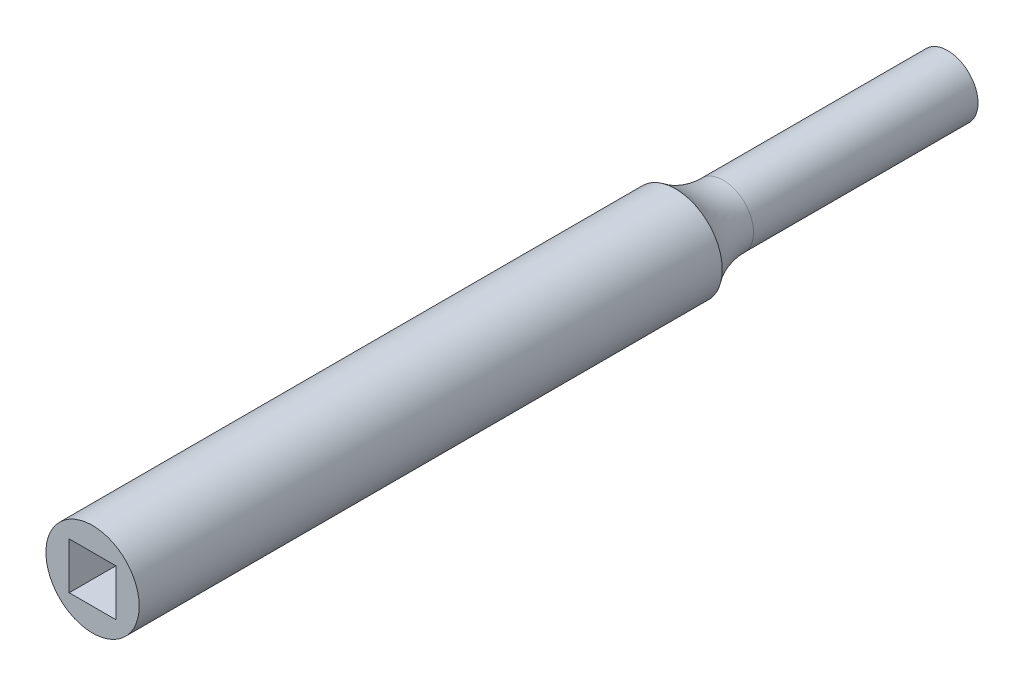
ISO-10303-21;
HEADER;
FILE_DESCRIPTION(('STEP AP214'),'2;1');
FILE_NAME('part.step','',(''),(''),'','','');
FILE_SCHEMA(('AUTOMOTIVE_DESIGN { 1 0 10303 214 1 1 1 1 }'));
ENDSEC;
DATA;
#1=APPLICATION_CONTEXT('core data for automotive mechanical design processes');
#2=APPLICATION_PROTOCOL_DEFINITION('international standard','automotive_design',2000,#1);
#3=PRODUCT_CONTEXT('',#1,'mechanical');
#4=PRODUCT('Part','Part','',(#3));
#5=PRODUCT_RELATED_PRODUCT_CATEGORY('part','',(#4));
#6=PRODUCT_DEFINITION_FORMATION('','',#4);
#7=PRODUCT_DEFINITION_CONTEXT('part definition',#1,'design');
#8=PRODUCT_DEFINITION('design','',#6,#7);
#9=PRODUCT_DEFINITION_SHAPE('','',#8);
#10=(LENGTH_UNIT() NAMED_UNIT(*) SI_UNIT(.MILLI.,.METRE.));
#11=(NAMED_UNIT(*) PLANE_ANGLE_UNIT() SI_UNIT($,.RADIAN.));
#12=(NAMED_UNIT(*) SI_UNIT($,.STERADIAN.) SOLID_ANGLE_UNIT());
#13=UNCERTAINTY_MEASURE_WITH_UNIT(LENGTH_MEASURE(1.E-05),#10,'distance_accuracy_value','');
#14=(GEOMETRIC_REPRESENTATION_CONTEXT(3) GLOBAL_UNCERTAINTY_ASSIGNED_CONTEXT((#13)) GLOBAL_UNIT_ASSIGNED_CONTEXT((#10,
#11,#12)) REPRESENTATION_CONTEXT('',''));
#15=CARTESIAN_POINT('',(0.,0.,0.));
#16=DIRECTION('',(0.,0.,1.));
#17=DIRECTION('',(1.,0.,0.));
#18=AXIS2_PLACEMENT_3D('',#15,#16,#17);
#19=CARTESIAN_POINT('',(0.,0.,35.));
#20=DIRECTION('',(0.,0.,-1.));
#21=DIRECTION('',(-1.,0.,0.));
#22=AXIS2_PLACEMENT_3D('',#19,#20,#21);
#23=CYLINDRICAL_SURFACE('',#22,3.9);
#24=CARTESIAN_POINT('',(0.,0.,28.8689315776123));
#25=DIRECTION('',(0.,0.,1.));
#26=DIRECTION('',(1.,0.,0.));
#27=AXIS2_PLACEMENT_3D('',#24,#25,#26);
#28=CIRCLE('',#27,3.9);
#29=CARTESIAN_POINT('',(3.9,0.,28.8689315776123));
#30=VERTEX_POINT('',#29);
#31=EDGE_CURVE('E11',#30,#30,#28,.F.);
#32=ORIENTED_EDGE('',*,*,#31,.T.);
#33=EDGE_LOOP('',(#32));
#34=FACE_BOUND('',#33,.T.);
#35=CARTESIAN_POINT('',(0.,0.,0.));
#36=DIRECTION('',(0.,0.,1.));
#37=DIRECTION('',(1.,0.,0.));
#38=AXIS2_PLACEMENT_3D('',#35,#36,#37);
#39=CIRCLE('',#38,3.9);
#40=CARTESIAN_POINT('',(3.9,0.,0.));
#41=VERTEX_POINT('',#40);
#42=EDGE_CURVE('E48',#41,#41,#39,.T.);
#43=ORIENTED_EDGE('',*,*,#42,.T.);
#44=EDGE_LOOP('',(#43));
#45=FACE_BOUND('',#44,.T.);
#46=ADVANCED_FACE('F39',(#34,#45),#23,.T.);
#47=CARTESIAN_POINT('',(0.,0.,0.));
#48=DIRECTION('',(0.,0.,1.));
#49=DIRECTION('',(1.,0.,0.));
#50=AXIS2_PLACEMENT_3D('',#47,#48,#49);
#51=PLANE('',#50);
#52=ORIENTED_EDGE('',*,*,#42,.F.);
#53=EDGE_LOOP('',(#52));
#54=FACE_BOUND('',#53,.T.);
#55=ADVANCED_FACE('F142',(#54),#51,.F.);
#56=CARTESIAN_POINT('',(0.,0.,110.));
#57=DIRECTION('',(0.,0.,-1.));
#58=DIRECTION('',(-1.,0.,0.));
#59=AXIS2_PLACEMENT_3D('',#56,#57,#58);
#60=CYLINDRICAL_SURFACE('',#59,6.);
#61=CARTESIAN_POINT('',(0.,0.,110.));
#62=DIRECTION('',(0.,0.,1.));
#63=DIRECTION('',(1.,0.,0.));
#64=AXIS2_PLACEMENT_3D('',#61,#62,#63);
#65=CIRCLE('',#64,6.);
#66=CARTESIAN_POINT('',(6.,0.,110.));
#67=VERTEX_POINT('',#66);
#68=EDGE_CURVE('E131',#67,#67,#65,.T.);
#69=ORIENTED_EDGE('',*,*,#68,.F.);
#70=EDGE_LOOP('',(#69));
#71=FACE_BOUND('',#70,.T.);
#72=CARTESIAN_POINT('',(0.,0.,35.));
#73=DIRECTION('',(0.,0.,1.));
#74=DIRECTION('',(1.,0.,0.));
#75=AXIS2_PLACEMENT_3D('',#72,#73,#74);
#76=CIRCLE('',#75,6.);
#77=CARTESIAN_POINT('',(6.,0.,35.));
#78=VERTEX_POINT('',#77);
#79=EDGE_CURVE('E126',#78,#78,#76,.T.);
#80=ORIENTED_EDGE('',*,*,#79,.T.);
#81=EDGE_LOOP('',(#80));
#82=FACE_BOUND('',#81,.T.);
#83=ADVANCED_FACE('F144',(#71,#82),#60,.T.);
#84=CARTESIAN_POINT('',(0.,0.,110.));
#85=DIRECTION('',(0.,0.,1.));
#86=DIRECTION('',(1.,0.,0.));
#87=AXIS2_PLACEMENT_3D('',#84,#85,#86);
#88=PLANE('',#87);
#89=DIRECTION('',(0.,1.,0.));
#90=VECTOR('',#89,1.);
#91=CARTESIAN_POINT('',(3.,3.,110.));
#92=LINE('',#91,#90);
#93=CARTESIAN_POINT('',(3.,-3.,110.));
#94=VERTEX_POINT('',#93);
#95=CARTESIAN_POINT('',(3.,3.,110.));
#96=VERTEX_POINT('',#95);
#97=EDGE_CURVE('E55',#94,#96,#92,.T.);
#98=ORIENTED_EDGE('',*,*,#97,.F.);
#99=DIRECTION('',(1.,0.,0.));
#100=VECTOR('',#99,1.);
#101=CARTESIAN_POINT('',(3.,-3.,110.));
#102=LINE('',#101,#100);
#103=CARTESIAN_POINT('',(-3.,-3.,110.));
#104=VERTEX_POINT('',#103);
#105=EDGE_CURVE('E110',#104,#94,#102,.T.);
#106=ORIENTED_EDGE('',*,*,#105,.F.);
#107=DIRECTION('',(0.,-1.,0.));
#108=VECTOR('',#107,1.);
#109=CARTESIAN_POINT('',(-3.,3.,110.));
#110=LINE('',#109,#108);
#111=CARTESIAN_POINT('',(-3.,3.,110.));
#112=VERTEX_POINT('',#111);
#113=EDGE_CURVE('E119',#112,#104,#110,.T.);
#114=ORIENTED_EDGE('',*,*,#113,.F.);
#115=DIRECTION('',(-1.,0.,0.));
#116=VECTOR('',#115,1.);
#117=CARTESIAN_POINT('',(3.,3.,110.));
#118=LINE('',#117,#116);
#119=EDGE_CURVE('E90',#96,#112,#118,.T.);
#120=ORIENTED_EDGE('',*,*,#119,.F.);
#121=EDGE_LOOP('',(#98,#106,#114,#120));
#122=FACE_BOUND('',#121,.T.);
#123=ORIENTED_EDGE('',*,*,#68,.T.);
#124=EDGE_LOOP('',(#123));
#125=FACE_BOUND('',#124,.T.);
#126=ADVANCED_FACE('F150',(#122,#125),#88,.T.);
#127=CARTESIAN_POINT('',(0.,0.,28.8689315776123));
#128=DIRECTION('',(0.,0.,1.));
#129=DIRECTION('',(1.,0.,0.));
#130=AXIS2_PLACEMENT_3D('',#127,#128,#129);
#131=TOROIDAL_SURFACE('',#130,13.9,10.);
#132=ORIENTED_EDGE('',*,*,#31,.F.);
#133=EDGE_LOOP('',(#132));
#134=FACE_BOUND('',#133,.T.);
#135=ORIENTED_EDGE('',*,*,#79,.F.);
#136=EDGE_LOOP('',(#135));
#137=FACE_BOUND('',#136,.T.);
#138=ADVANCED_FACE('F41',(#134,#137),#131,.F.);
#139=CARTESIAN_POINT('',(3.,3.,90.));
#140=DIRECTION('',(1.,0.,0.));
#141=DIRECTION('',(0.,1.,0.));
#142=AXIS2_PLACEMENT_3D('',#139,#140,#141);
#143=PLANE('',#142);
#144=ORIENTED_EDGE('',*,*,#97,.T.);
#145=DIRECTION('',(0.,0.,1.));
#146=VECTOR('',#145,1.);
#147=CARTESIAN_POINT('',(3.,3.,90.));
#148=LINE('',#147,#146);
#149=CARTESIAN_POINT('',(3.,3.,90.));
#150=VERTEX_POINT('',#149);
#151=EDGE_CURVE('E78',#150,#96,#148,.T.);
#152=ORIENTED_EDGE('',*,*,#151,.F.);
#153=DIRECTION('',(0.,1.,0.));
#154=VECTOR('',#153,1.);
#155=CARTESIAN_POINT('',(3.,3.,90.));
#156=LINE('',#155,#154);
#157=CARTESIAN_POINT('',(3.,-3.,90.));
#158=VERTEX_POINT('',#157);
#159=EDGE_CURVE('E106',#158,#150,#156,.T.);
#160=ORIENTED_EDGE('',*,*,#159,.F.);
#161=DIRECTION('',(0.,0.,1.));
#162=VECTOR('',#161,1.);
#163=CARTESIAN_POINT('',(3.,-3.,90.));
#164=LINE('',#163,#162);
#165=EDGE_CURVE('E63',#158,#94,#164,.T.);
#166=ORIENTED_EDGE('',*,*,#165,.T.);
#167=EDGE_LOOP('',(#144,#152,#160,#166));
#168=FACE_BOUND('',#167,.T.);
#169=ADVANCED_FACE('F158',(#168),#143,.F.);
#170=CARTESIAN_POINT('',(3.,-3.,90.));
#171=DIRECTION('',(0.,-1.,0.));
#172=DIRECTION('',(1.,0.,0.));
#173=AXIS2_PLACEMENT_3D('',#170,#171,#172);
#174=PLANE('',#173);
#175=ORIENTED_EDGE('',*,*,#105,.T.);
#176=ORIENTED_EDGE('',*,*,#165,.F.);
#177=DIRECTION('',(1.,0.,0.));
#178=VECTOR('',#177,1.);
#179=CARTESIAN_POINT('',(3.,-3.,90.));
#180=LINE('',#179,#178);
#181=CARTESIAN_POINT('',(-3.,-3.,90.));
#182=VERTEX_POINT('',#181);
#183=EDGE_CURVE('E103',#182,#158,#180,.T.);
#184=ORIENTED_EDGE('',*,*,#183,.F.);
#185=DIRECTION('',(0.,0.,1.));
#186=VECTOR('',#185,1.);
#187=CARTESIAN_POINT('',(-3.,-3.,90.));
#188=LINE('',#187,#186);
#189=EDGE_CURVE('E95',#182,#104,#188,.T.);
#190=ORIENTED_EDGE('',*,*,#189,.T.);
#191=EDGE_LOOP('',(#175,#176,#184,#190));
#192=FACE_BOUND('',#191,.T.);
#193=ADVANCED_FACE('F161',(#192),#174,.F.);
#194=CARTESIAN_POINT('',(-3.,3.,90.));
#195=DIRECTION('',(-1.,0.,0.));
#196=DIRECTION('',(0.,-1.,0.));
#197=AXIS2_PLACEMENT_3D('',#194,#195,#196);
#198=PLANE('',#197);
#199=ORIENTED_EDGE('',*,*,#113,.T.);
#200=ORIENTED_EDGE('',*,*,#189,.F.);
#201=DIRECTION('',(0.,-1.,0.));
#202=VECTOR('',#201,1.);
#203=CARTESIAN_POINT('',(-3.,3.,90.));
#204=LINE('',#203,#202);
#205=CARTESIAN_POINT('',(-3.,3.,90.));
#206=VERTEX_POINT('',#205);
#207=EDGE_CURVE('E98',#206,#182,#204,.T.);
#208=ORIENTED_EDGE('',*,*,#207,.F.);
#209=DIRECTION('',(0.,0.,1.));
#210=VECTOR('',#209,1.);
#211=CARTESIAN_POINT('',(-3.,3.,90.));
#212=LINE('',#211,#210);
#213=EDGE_CURVE('E83',#206,#112,#212,.T.);
#214=ORIENTED_EDGE('',*,*,#213,.T.);
#215=EDGE_LOOP('',(#199,#200,#208,#214));
#216=FACE_BOUND('',#215,.T.);
#217=ADVANCED_FACE('F99',(#216),#198,.F.);
#218=CARTESIAN_POINT('',(3.,3.,90.));
#219=DIRECTION('',(0.,1.,0.));
#220=DIRECTION('',(-1.,0.,0.));
#221=AXIS2_PLACEMENT_3D('',#218,#219,#220);
#222=PLANE('',#221);
#223=ORIENTED_EDGE('',*,*,#119,.T.);
#224=ORIENTED_EDGE('',*,*,#213,.F.);
#225=DIRECTION('',(-1.,0.,0.));
#226=VECTOR('',#225,1.);
#227=CARTESIAN_POINT('',(3.,3.,90.));
#228=LINE('',#227,#226);
#229=EDGE_CURVE('E87',#150,#206,#228,.T.);
#230=ORIENTED_EDGE('',*,*,#229,.F.);
#231=ORIENTED_EDGE('',*,*,#151,.T.);
#232=EDGE_LOOP('',(#223,#224,#230,#231));
#233=FACE_BOUND('',#232,.T.);
#234=ADVANCED_FACE('F85',(#233),#222,.F.);
#235=CARTESIAN_POINT('',(0.,0.,90.));
#236=DIRECTION('',(0.,0.,-1.));
#237=DIRECTION('',(-1.,0.,0.));
#238=AXIS2_PLACEMENT_3D('',#235,#236,#237);
#239=PLANE('',#238);
#240=ORIENTED_EDGE('',*,*,#159,.T.);
#241=ORIENTED_EDGE('',*,*,#229,.T.);
#242=ORIENTED_EDGE('',*,*,#207,.T.);
#243=ORIENTED_EDGE('',*,*,#183,.T.);
#244=EDGE_LOOP('',(#240,#241,#242,#243));
#245=FACE_BOUND('',#244,.T.);
#246=ADVANCED_FACE('F105',(#245),#239,.F.);
#247=CLOSED_SHELL('',(#46,#55,#83,#126,#138,#169,#193,#217,#234,#246));
#248=MANIFOLD_SOLID_BREP('B2',#247);
#249=ADVANCED_BREP_SHAPE_REPRESENTATION('',(#18,#248),#14);
#250=SHAPE_DEFINITION_REPRESENTATION(#9,#249);
ENDSEC;
END-ISO-10303-21;
